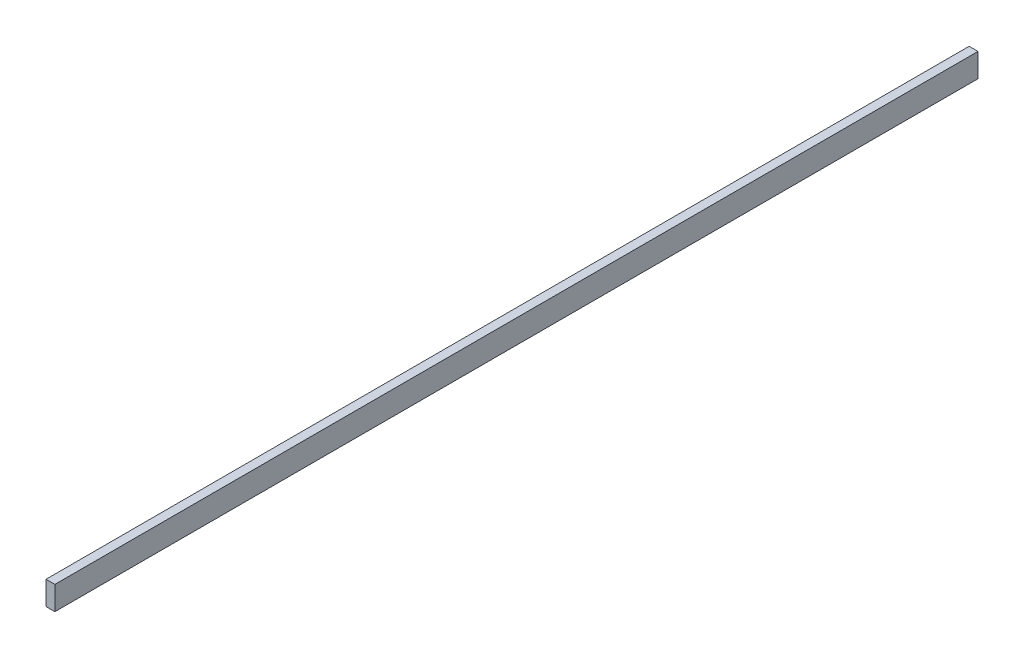
ISO-10303-21;
HEADER;
FILE_DESCRIPTION(('STEP AP214'),'2;1');
FILE_NAME('part.step','',(''),(''),'','','');
FILE_SCHEMA(('AUTOMOTIVE_DESIGN { 1 0 10303 214 1 1 1 1 }'));
ENDSEC;
DATA;
#1=APPLICATION_CONTEXT('core data for automotive mechanical design processes');
#2=APPLICATION_PROTOCOL_DEFINITION('international standard','automotive_design',2000,#1);
#3=PRODUCT_CONTEXT('',#1,'mechanical');
#4=PRODUCT('Part','Part','',(#3));
#5=PRODUCT_RELATED_PRODUCT_CATEGORY('part','',(#4));
#6=PRODUCT_DEFINITION_FORMATION('','',#4);
#7=PRODUCT_DEFINITION_CONTEXT('part definition',#1,'design');
#8=PRODUCT_DEFINITION('design','',#6,#7);
#9=PRODUCT_DEFINITION_SHAPE('','',#8);
#10=(LENGTH_UNIT() NAMED_UNIT(*) SI_UNIT(.MILLI.,.METRE.));
#11=(NAMED_UNIT(*) PLANE_ANGLE_UNIT() SI_UNIT($,.RADIAN.));
#12=(NAMED_UNIT(*) SI_UNIT($,.STERADIAN.) SOLID_ANGLE_UNIT());
#13=UNCERTAINTY_MEASURE_WITH_UNIT(LENGTH_MEASURE(1.E-05),#10,'distance_accuracy_value','');
#14=(GEOMETRIC_REPRESENTATION_CONTEXT(3) GLOBAL_UNCERTAINTY_ASSIGNED_CONTEXT((#13)) GLOBAL_UNIT_ASSIGNED_CONTEXT((#10,
#11,#12)) REPRESENTATION_CONTEXT('',''));
#15=CARTESIAN_POINT('',(0.,0.,0.));
#16=DIRECTION('',(0.,0.,1.));
#17=DIRECTION('',(1.,0.,0.));
#18=AXIS2_PLACEMENT_3D('',#15,#16,#17);
#19=CARTESIAN_POINT('',(1.5,4.,-156.));
#20=DIRECTION('',(0.,-1.,0.));
#21=DIRECTION('',(0.,0.,-1.));
#22=AXIS2_PLACEMENT_3D('',#19,#20,#21);
#23=PLANE('',#22);
#24=DIRECTION('',(0.,0.,1.));
#25=VECTOR('',#24,1.);
#26=CARTESIAN_POINT('',(-1.5,4.,-156.));
#27=LINE('',#26,#25);
#28=CARTESIAN_POINT('',(-1.5,4.,-156.));
#29=VERTEX_POINT('',#28);
#30=CARTESIAN_POINT('',(-1.5,4.,156.));
#31=VERTEX_POINT('',#30);
#32=EDGE_CURVE('E113',#29,#31,#27,.T.);
#33=ORIENTED_EDGE('',*,*,#32,.T.);
#34=DIRECTION('',(-1.,0.,0.));
#35=VECTOR('',#34,1.);
#36=CARTESIAN_POINT('',(1.5,4.,156.));
#37=LINE('',#36,#35);
#38=CARTESIAN_POINT('',(1.5,4.,156.));
#39=VERTEX_POINT('',#38);
#40=EDGE_CURVE('E11',#39,#31,#37,.T.);
#41=ORIENTED_EDGE('',*,*,#40,.F.);
#42=DIRECTION('',(0.,0.,1.));
#43=VECTOR('',#42,1.);
#44=CARTESIAN_POINT('',(1.5,4.,-156.));
#45=LINE('',#44,#43);
#46=CARTESIAN_POINT('',(1.5,4.,-156.));
#47=VERTEX_POINT('',#46);
#48=EDGE_CURVE('E97',#47,#39,#45,.T.);
#49=ORIENTED_EDGE('',*,*,#48,.F.);
#50=DIRECTION('',(-1.,0.,0.));
#51=VECTOR('',#50,1.);
#52=CARTESIAN_POINT('',(1.5,4.,-156.));
#53=LINE('',#52,#51);
#54=EDGE_CURVE('E109',#47,#29,#53,.T.);
#55=ORIENTED_EDGE('',*,*,#54,.T.);
#56=EDGE_LOOP('',(#33,#41,#49,#55));
#57=FACE_BOUND('',#56,.T.);
#58=ADVANCED_FACE('F45',(#57),#23,.F.);
#59=CARTESIAN_POINT('',(1.5,-4.,156.));
#60=DIRECTION('',(0.,0.,-1.));
#61=DIRECTION('',(-1.,0.,0.));
#62=AXIS2_PLACEMENT_3D('',#59,#60,#61);
#63=PLANE('',#62);
#64=DIRECTION('',(0.,-1.,0.));
#65=VECTOR('',#64,1.);
#66=CARTESIAN_POINT('',(-1.5,-4.,156.));
#67=LINE('',#66,#65);
#68=CARTESIAN_POINT('',(-1.5,-4.,156.));
#69=VERTEX_POINT('',#68);
#70=EDGE_CURVE('E102',#31,#69,#67,.T.);
#71=ORIENTED_EDGE('',*,*,#70,.T.);
#72=DIRECTION('',(-1.,0.,0.));
#73=VECTOR('',#72,1.);
#74=CARTESIAN_POINT('',(1.5,-4.,156.));
#75=LINE('',#74,#73);
#76=CARTESIAN_POINT('',(1.5,-4.,156.));
#77=VERTEX_POINT('',#76);
#78=EDGE_CURVE('E54',#77,#69,#75,.T.);
#79=ORIENTED_EDGE('',*,*,#78,.F.);
#80=DIRECTION('',(0.,-1.,0.));
#81=VECTOR('',#80,1.);
#82=CARTESIAN_POINT('',(1.5,-4.,156.));
#83=LINE('',#82,#81);
#84=EDGE_CURVE('E92',#39,#77,#83,.T.);
#85=ORIENTED_EDGE('',*,*,#84,.F.);
#86=ORIENTED_EDGE('',*,*,#40,.T.);
#87=EDGE_LOOP('',(#71,#79,#85,#86));
#88=FACE_BOUND('',#87,.T.);
#89=ADVANCED_FACE('F101',(#88),#63,.F.);
#90=CARTESIAN_POINT('',(1.5,-4.,-156.));
#91=DIRECTION('',(0.,1.,0.));
#92=DIRECTION('',(0.,0.,1.));
#93=AXIS2_PLACEMENT_3D('',#90,#91,#92);
#94=PLANE('',#93);
#95=DIRECTION('',(0.,0.,-1.));
#96=VECTOR('',#95,1.);
#97=CARTESIAN_POINT('',(-1.5,-4.,-156.));
#98=LINE('',#97,#96);
#99=CARTESIAN_POINT('',(-1.5,-4.,-156.));
#100=VERTEX_POINT('',#99);
#101=EDGE_CURVE('E79',#69,#100,#98,.T.);
#102=ORIENTED_EDGE('',*,*,#101,.T.);
#103=DIRECTION('',(-1.,0.,0.));
#104=VECTOR('',#103,1.);
#105=CARTESIAN_POINT('',(1.5,-4.,-156.));
#106=LINE('',#105,#104);
#107=CARTESIAN_POINT('',(1.5,-4.,-156.));
#108=VERTEX_POINT('',#107);
#109=EDGE_CURVE('E104',#108,#100,#106,.T.);
#110=ORIENTED_EDGE('',*,*,#109,.F.);
#111=DIRECTION('',(0.,0.,-1.));
#112=VECTOR('',#111,1.);
#113=CARTESIAN_POINT('',(1.5,-4.,-156.));
#114=LINE('',#113,#112);
#115=EDGE_CURVE('E95',#77,#108,#114,.T.);
#116=ORIENTED_EDGE('',*,*,#115,.F.);
#117=ORIENTED_EDGE('',*,*,#78,.T.);
#118=EDGE_LOOP('',(#102,#110,#116,#117));
#119=FACE_BOUND('',#118,.T.);
#120=ADVANCED_FACE('F105',(#119),#94,.F.);
#121=CARTESIAN_POINT('',(1.5,-4.,-156.));
#122=DIRECTION('',(0.,0.,1.));
#123=DIRECTION('',(1.,0.,0.));
#124=AXIS2_PLACEMENT_3D('',#121,#122,#123);
#125=PLANE('',#124);
#126=DIRECTION('',(0.,1.,0.));
#127=VECTOR('',#126,1.);
#128=CARTESIAN_POINT('',(-1.5,-4.,-156.));
#129=LINE('',#128,#127);
#130=EDGE_CURVE('E85',#100,#29,#129,.T.);
#131=ORIENTED_EDGE('',*,*,#130,.T.);
#132=ORIENTED_EDGE('',*,*,#54,.F.);
#133=DIRECTION('',(0.,1.,0.));
#134=VECTOR('',#133,1.);
#135=CARTESIAN_POINT('',(1.5,-4.,-156.));
#136=LINE('',#135,#134);
#137=EDGE_CURVE('E62',#108,#47,#136,.T.);
#138=ORIENTED_EDGE('',*,*,#137,.F.);
#139=ORIENTED_EDGE('',*,*,#109,.T.);
#140=EDGE_LOOP('',(#131,#132,#138,#139));
#141=FACE_BOUND('',#140,.T.);
#142=ADVANCED_FACE('F126',(#141),#125,.F.);
#143=CARTESIAN_POINT('',(1.5,0.,0.));
#144=DIRECTION('',(-1.,0.,0.));
#145=DIRECTION('',(0.,0.,1.));
#146=AXIS2_PLACEMENT_3D('',#143,#144,#145);
#147=PLANE('',#146);
#148=ORIENTED_EDGE('',*,*,#48,.T.);
#149=ORIENTED_EDGE('',*,*,#84,.T.);
#150=ORIENTED_EDGE('',*,*,#115,.T.);
#151=ORIENTED_EDGE('',*,*,#137,.T.);
#152=EDGE_LOOP('',(#148,#149,#150,#151));
#153=FACE_BOUND('',#152,.T.);
#154=ADVANCED_FACE('F93',(#153),#147,.F.);
#155=CARTESIAN_POINT('',(-1.5,0.,0.));
#156=DIRECTION('',(-1.,0.,0.));
#157=DIRECTION('',(0.,0.,1.));
#158=AXIS2_PLACEMENT_3D('',#155,#156,#157);
#159=PLANE('',#158);
#160=ORIENTED_EDGE('',*,*,#32,.F.);
#161=ORIENTED_EDGE('',*,*,#130,.F.);
#162=ORIENTED_EDGE('',*,*,#101,.F.);
#163=ORIENTED_EDGE('',*,*,#70,.F.);
#164=EDGE_LOOP('',(#160,#161,#162,#163));
#165=FACE_BOUND('',#164,.T.);
#166=ADVANCED_FACE('F129',(#165),#159,.T.);
#167=CLOSED_SHELL('',(#58,#89,#120,#142,#154,#166));
#168=MANIFOLD_SOLID_BREP('B2',#167);
#169=ADVANCED_BREP_SHAPE_REPRESENTATION('',(#18,#168),#14);
#170=SHAPE_DEFINITION_REPRESENTATION(#9,#169);
ENDSEC;
END-ISO-10303-21;
